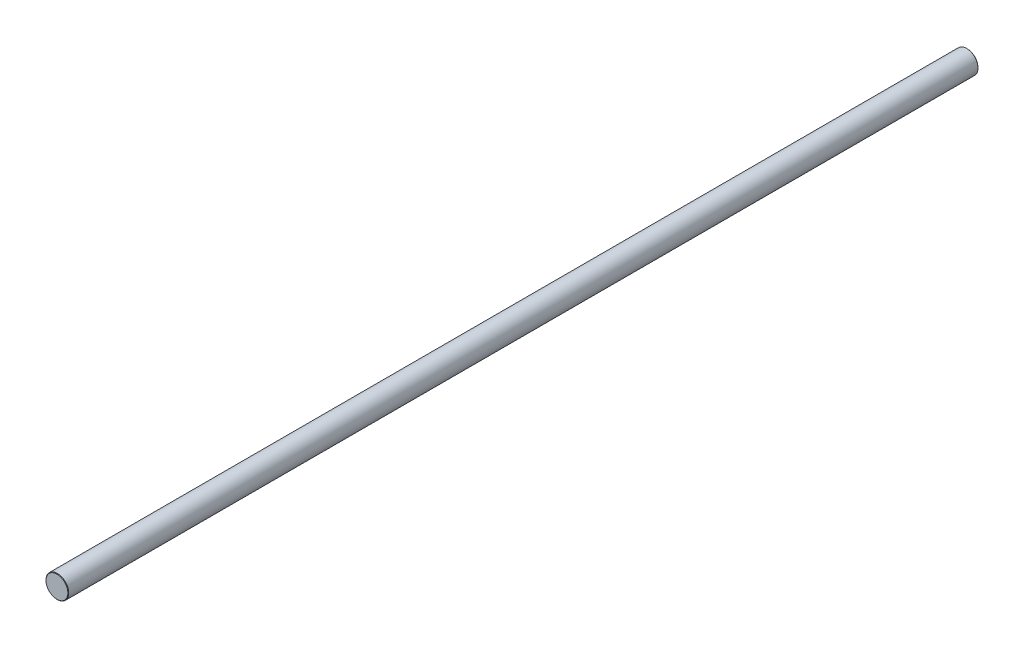
ISO-10303-21;
HEADER;
FILE_DESCRIPTION(('STEP AP214'),'2;1');
FILE_NAME('part.step','',(''),(''),'','','');
FILE_SCHEMA(('AUTOMOTIVE_DESIGN { 1 0 10303 214 1 1 1 1 }'));
ENDSEC;
DATA;
#1=APPLICATION_CONTEXT('core data for automotive mechanical design processes');
#2=APPLICATION_PROTOCOL_DEFINITION('international standard','automotive_design',2000,#1);
#3=PRODUCT_CONTEXT('',#1,'mechanical');
#4=PRODUCT('Part','Part','',(#3));
#5=PRODUCT_RELATED_PRODUCT_CATEGORY('part','',(#4));
#6=PRODUCT_DEFINITION_FORMATION('','',#4);
#7=PRODUCT_DEFINITION_CONTEXT('part definition',#1,'design');
#8=PRODUCT_DEFINITION('design','',#6,#7);
#9=PRODUCT_DEFINITION_SHAPE('','',#8);
#10=(LENGTH_UNIT() NAMED_UNIT(*) SI_UNIT(.MILLI.,.METRE.));
#11=(NAMED_UNIT(*) PLANE_ANGLE_UNIT() SI_UNIT($,.RADIAN.));
#12=(NAMED_UNIT(*) SI_UNIT($,.STERADIAN.) SOLID_ANGLE_UNIT());
#13=UNCERTAINTY_MEASURE_WITH_UNIT(LENGTH_MEASURE(1.E-05),#10,'distance_accuracy_value','');
#14=(GEOMETRIC_REPRESENTATION_CONTEXT(3) GLOBAL_UNCERTAINTY_ASSIGNED_CONTEXT((#13)) GLOBAL_UNIT_ASSIGNED_CONTEXT((#10,
#11,#12)) REPRESENTATION_CONTEXT('',''));
#15=CARTESIAN_POINT('',(0.,0.,0.));
#16=DIRECTION('',(0.,0.,1.));
#17=DIRECTION('',(1.,0.,0.));
#18=AXIS2_PLACEMENT_3D('',#15,#16,#17);
#19=CARTESIAN_POINT('',(0.,0.,200.));
#20=DIRECTION('',(0.,0.,-1.));
#21=DIRECTION('',(-1.,0.,0.));
#22=AXIS2_PLACEMENT_3D('',#19,#20,#21);
#23=CYLINDRICAL_SURFACE('',#22,5.);
#24=CARTESIAN_POINT('',(0.,0.,-199.8));
#25=DIRECTION('',(0.,0.,1.));
#26=DIRECTION('',(1.,0.,0.));
#27=AXIS2_PLACEMENT_3D('',#24,#25,#26);
#28=CIRCLE('',#27,5.);
#29=CARTESIAN_POINT('',(4.99999999999999,0.,-199.8));
#30=VERTEX_POINT('',#29);
#31=EDGE_CURVE('E43',#30,#30,#28,.T.);
#32=ORIENTED_EDGE('',*,*,#31,.T.);
#33=EDGE_LOOP('',(#32));
#34=FACE_BOUND('',#33,.T.);
#35=CARTESIAN_POINT('',(0.,0.,199.8));
#36=DIRECTION('',(0.,0.,1.));
#37=DIRECTION('',(1.,0.,0.));
#38=AXIS2_PLACEMENT_3D('',#35,#36,#37);
#39=CIRCLE('',#38,5.);
#40=CARTESIAN_POINT('',(5.,0.,199.8));
#41=VERTEX_POINT('',#40);
#42=EDGE_CURVE('E47',#41,#41,#39,.F.);
#43=ORIENTED_EDGE('',*,*,#42,.T.);
#44=EDGE_LOOP('',(#43));
#45=FACE_BOUND('',#44,.T.);
#46=ADVANCED_FACE('F32',(#34,#45),#23,.T.);
#47=CARTESIAN_POINT('',(0.,0.,200.));
#48=DIRECTION('',(0.,0.,1.));
#49=DIRECTION('',(1.,0.,0.));
#50=AXIS2_PLACEMENT_3D('',#47,#48,#49);
#51=PLANE('',#50);
#52=CARTESIAN_POINT('',(0.,0.,200.));
#53=DIRECTION('',(0.,0.,1.));
#54=DIRECTION('',(1.,0.,0.));
#55=AXIS2_PLACEMENT_3D('',#52,#53,#54);
#56=CIRCLE('',#55,4.80000000000003);
#57=CARTESIAN_POINT('',(4.80000000000003,0.,200.));
#58=VERTEX_POINT('',#57);
#59=EDGE_CURVE('E10',#58,#58,#56,.T.);
#60=ORIENTED_EDGE('',*,*,#59,.T.);
#61=EDGE_LOOP('',(#60));
#62=FACE_BOUND('',#61,.T.);
#63=ADVANCED_FACE('F63',(#62),#51,.T.);
#64=CARTESIAN_POINT('',(0.,0.,-200.));
#65=DIRECTION('',(0.,0.,1.));
#66=DIRECTION('',(1.,0.,0.));
#67=AXIS2_PLACEMENT_3D('',#64,#65,#66);
#68=PLANE('',#67);
#69=CARTESIAN_POINT('',(0.,0.,-200.));
#70=DIRECTION('',(0.,0.,1.));
#71=DIRECTION('',(1.,0.,0.));
#72=AXIS2_PLACEMENT_3D('',#69,#70,#71);
#73=CIRCLE('',#72,4.80000000000003);
#74=CARTESIAN_POINT('',(4.80000000000001,0.,-200.));
#75=VERTEX_POINT('',#74);
#76=EDGE_CURVE('E39',#75,#75,#73,.F.);
#77=ORIENTED_EDGE('',*,*,#76,.T.);
#78=EDGE_LOOP('',(#77));
#79=FACE_BOUND('',#78,.T.);
#80=ADVANCED_FACE('F60',(#79),#68,.F.);
#81=CARTESIAN_POINT('',(0.,0.,-199.8));
#82=DIRECTION('',(0.,0.,1.));
#83=DIRECTION('',(1.,0.,0.));
#84=AXIS2_PLACEMENT_3D('',#81,#82,#83);
#85=CONICAL_SURFACE('',#84,5.,0.785398163397576);
#86=CARTESIAN_POINT('',(4.80000000000001,0.,-200.));
#87=CARTESIAN_POINT('',(4.80208333333334,0.,-199.997916666667));
#88=CARTESIAN_POINT('',(4.80416666666667,0.,-199.995833333333));
#89=CARTESIAN_POINT('',(4.80833333333335,0.,-199.991666666667));
#90=CARTESIAN_POINT('',(4.81041666666668,0.,-199.989583333333));
#91=CARTESIAN_POINT('',(4.81458333333335,0.,-199.985416666667));
#92=CARTESIAN_POINT('',(4.81666666666667,0.,-199.983333333333));
#93=CARTESIAN_POINT('',(4.82083333333334,0.,-199.979166666667));
#94=CARTESIAN_POINT('',(4.82291666666668,0.,-199.977083333333));
#95=CARTESIAN_POINT('',(4.82708333333334,0.,-199.972916666667));
#96=CARTESIAN_POINT('',(4.82916666666667,0.,-199.970833333333));
#97=CARTESIAN_POINT('',(4.83333333333334,0.,-199.966666666667));
#98=CARTESIAN_POINT('',(4.83541666666668,0.,-199.964583333333));
#99=CARTESIAN_POINT('',(4.83958333333334,0.,-199.960416666667));
#100=CARTESIAN_POINT('',(4.84166666666667,0.,-199.958333333333));
#101=CARTESIAN_POINT('',(4.84583333333334,0.,-199.954166666667));
#102=CARTESIAN_POINT('',(4.84791666666667,0.,-199.952083333333));
#103=CARTESIAN_POINT('',(4.85208333333334,0.,-199.947916666667));
#104=CARTESIAN_POINT('',(4.85416666666667,0.,-199.945833333333));
#105=CARTESIAN_POINT('',(4.85833333333334,0.,-199.941666666667));
#106=CARTESIAN_POINT('',(4.86041666666667,0.,-199.939583333333));
#107=CARTESIAN_POINT('',(4.86458333333334,0.,-199.935416666667));
#108=CARTESIAN_POINT('',(4.86666666666667,0.,-199.933333333333));
#109=CARTESIAN_POINT('',(4.87083333333334,0.,-199.929166666667));
#110=CARTESIAN_POINT('',(4.87291666666667,0.,-199.927083333333));
#111=CARTESIAN_POINT('',(4.87708333333333,0.,-199.922916666667));
#112=CARTESIAN_POINT('',(4.87916666666667,0.,-199.920833333333));
#113=CARTESIAN_POINT('',(4.88333333333334,0.,-199.916666666667));
#114=CARTESIAN_POINT('',(4.88541666666667,0.,-199.914583333333));
#115=CARTESIAN_POINT('',(4.88958333333333,0.,-199.910416666667));
#116=CARTESIAN_POINT('',(4.89166666666667,0.,-199.908333333333));
#117=CARTESIAN_POINT('',(4.89583333333334,0.,-199.904166666667));
#118=CARTESIAN_POINT('',(4.89791666666667,0.,-199.902083333333));
#119=CARTESIAN_POINT('',(4.90208333333333,0.,-199.897916666667));
#120=CARTESIAN_POINT('',(4.90416666666666,0.,-199.895833333333));
#121=CARTESIAN_POINT('',(4.90833333333333,0.,-199.891666666667));
#122=CARTESIAN_POINT('',(4.91041666666667,0.,-199.889583333333));
#123=CARTESIAN_POINT('',(4.91458333333333,0.,-199.885416666667));
#124=CARTESIAN_POINT('',(4.91666666666666,0.,-199.883333333333));
#125=CARTESIAN_POINT('',(4.92083333333333,0.,-199.879166666667));
#126=CARTESIAN_POINT('',(4.92291666666667,0.,-199.877083333333));
#127=CARTESIAN_POINT('',(4.92708333333333,0.,-199.872916666667));
#128=CARTESIAN_POINT('',(4.92916666666666,0.,-199.870833333333));
#129=CARTESIAN_POINT('',(4.93333333333333,0.,-199.866666666667));
#130=CARTESIAN_POINT('',(4.93541666666666,0.,-199.864583333333));
#131=CARTESIAN_POINT('',(4.93958333333333,0.,-199.860416666667));
#132=CARTESIAN_POINT('',(4.94166666666666,0.,-199.858333333333));
#133=CARTESIAN_POINT('',(4.94583333333332,0.,-199.854166666667));
#134=CARTESIAN_POINT('',(4.94791666666666,0.,-199.852083333333));
#135=CARTESIAN_POINT('',(4.95208333333333,0.,-199.847916666667));
#136=CARTESIAN_POINT('',(4.95416666666666,0.,-199.845833333333));
#137=CARTESIAN_POINT('',(4.95833333333333,0.,-199.841666666667));
#138=CARTESIAN_POINT('',(4.96041666666666,0.,-199.839583333333));
#139=CARTESIAN_POINT('',(4.96458333333332,0.,-199.835416666667));
#140=CARTESIAN_POINT('',(4.96666666666666,0.,-199.833333333333));
#141=CARTESIAN_POINT('',(4.97083333333333,0.,-199.829166666667));
#142=CARTESIAN_POINT('',(4.97291666666665,0.,-199.827083333333));
#143=CARTESIAN_POINT('',(4.97708333333332,0.,-199.822916666667));
#144=CARTESIAN_POINT('',(4.97916666666666,0.,-199.820833333333));
#145=CARTESIAN_POINT('',(4.98333333333332,0.,-199.816666666667));
#146=CARTESIAN_POINT('',(4.98541666666665,0.,-199.814583333333));
#147=CARTESIAN_POINT('',(4.98958333333332,0.,-199.810416666667));
#148=CARTESIAN_POINT('',(4.99166666666665,0.,-199.808333333333));
#149=CARTESIAN_POINT('',(4.99583333333333,0.,-199.804166666667));
#150=CARTESIAN_POINT('',(4.99791666666666,0.,-199.802083333333));
#151=CARTESIAN_POINT('',(4.99999999999999,0.,-199.8));
#152=B_SPLINE_CURVE_WITH_KNOTS('',3,(#86,#87,#88,#89,#90,#91,#92,#93,#94,#95,#96,#97,#98,#99,
#100,#101,#102,#103,#104,#105,#106,#107,#108,#109,#110,#111,#112,#113,#114,#115,#116,#117,#118,
#119,#120,#121,#122,#123,#124,#125,#126,#127,#128,#129,#130,#131,#132,#133,#134,#135,#136,#137,
#138,#139,#140,#141,#142,#143,#144,#145,#146,#147,#148,#149,#150,#151),.UNSPECIFIED.,.F.,.F.,(4,
2,2,2,2,2,2,2,2,2,2,2,2,2,2,2,2,2,2,2,2,2,2,2,2,2,2,2,2,2,2,2,4),(0.,0.00883883476484068,
0.0176776695296617,0.0265165042945018,0.0353553390593229,0.0441941738241635,0.0530330085889846,
0.0618718433538253,0.0707106781186463,0.0795495128834668,0.0883883476483075,0.0972271824131285,
0.106066017177969,0.11490485194279,0.123743686707631,0.132582521472452,0.141421356237272,
0.150260191002113,0.159099025766934,0.167937860531775,0.176776695296596,0.185615530061437,
0.194454364826258,0.203293199591098,0.212132034355919,0.22097086912074,0.229809703885581,
0.238648538650402,0.247487373415242,0.256326208180063,0.265165042944904,0.274003877709725,
0.282842712474565),.UNSPECIFIED.);
#153=EDGE_CURVE('BSEAM56',#75,#30,#152,.T.);
#154=ORIENTED_EDGE('',*,*,#76,.F.);
#155=ORIENTED_EDGE('',*,*,#31,.F.);
#156=ORIENTED_EDGE('',*,*,#153,.T.);
#157=ORIENTED_EDGE('',*,*,#153,.F.);
#158=EDGE_LOOP('',(#154,#156,#155,#157));
#159=FACE_BOUND('',#158,.T.);
#160=ADVANCED_FACE('F56',(#159),#85,.T.);
#161=CARTESIAN_POINT('',(0.,0.,200.));
#162=DIRECTION('',(0.,0.,-1.));
#163=DIRECTION('',(-1.,0.,0.));
#164=AXIS2_PLACEMENT_3D('',#161,#162,#163);
#165=CONICAL_SURFACE('',#164,4.80000000000003,0.785398163397368);
#166=ORIENTED_EDGE('',*,*,#42,.F.);
#167=EDGE_LOOP('',(#166));
#168=FACE_BOUND('',#167,.T.);
#169=ORIENTED_EDGE('',*,*,#59,.F.);
#170=EDGE_LOOP('',(#169));
#171=FACE_BOUND('',#170,.T.);
#172=ADVANCED_FACE('F34',(#168,#171),#165,.T.);
#173=CLOSED_SHELL('',(#46,#63,#80,#160,#172));
#174=MANIFOLD_SOLID_BREP('B2',#173);
#175=ADVANCED_BREP_SHAPE_REPRESENTATION('',(#18,#174),#14);
#176=SHAPE_DEFINITION_REPRESENTATION(#9,#175);
ENDSEC;
END-ISO-10303-21;
